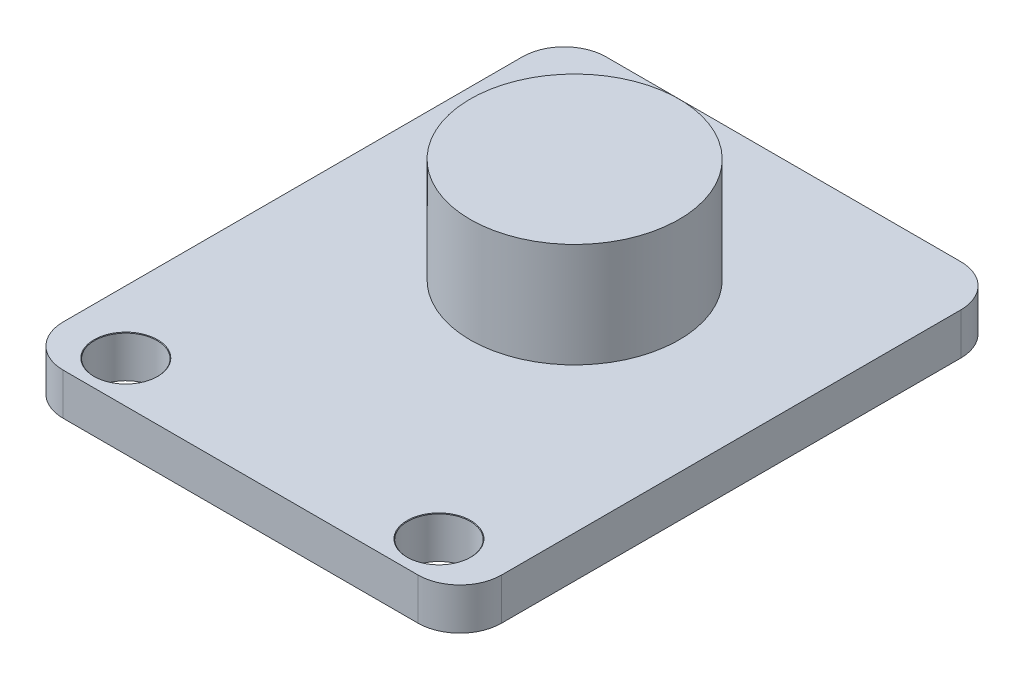
ISO-10303-21;
HEADER;
FILE_DESCRIPTION(('STEP AP214'),'2;1');
FILE_NAME('part.step','',(''),(''),'','','');
FILE_SCHEMA(('AUTOMOTIVE_DESIGN { 1 0 10303 214 1 1 1 1 }'));
ENDSEC;
DATA;
#1=APPLICATION_CONTEXT('core data for automotive mechanical design processes');
#2=APPLICATION_PROTOCOL_DEFINITION('international standard','automotive_design',2000,#1);
#3=PRODUCT_CONTEXT('',#1,'mechanical');
#4=PRODUCT('Part','Part','',(#3));
#5=PRODUCT_RELATED_PRODUCT_CATEGORY('part','',(#4));
#6=PRODUCT_DEFINITION_FORMATION('','',#4);
#7=PRODUCT_DEFINITION_CONTEXT('part definition',#1,'design');
#8=PRODUCT_DEFINITION('design','',#6,#7);
#9=PRODUCT_DEFINITION_SHAPE('','',#8);
#10=(LENGTH_UNIT() NAMED_UNIT(*) SI_UNIT(.MILLI.,.METRE.));
#11=(NAMED_UNIT(*) PLANE_ANGLE_UNIT() SI_UNIT($,.RADIAN.));
#12=(NAMED_UNIT(*) SI_UNIT($,.STERADIAN.) SOLID_ANGLE_UNIT());
#13=UNCERTAINTY_MEASURE_WITH_UNIT(LENGTH_MEASURE(1.E-05),#10,'distance_accuracy_value','');
#14=(GEOMETRIC_REPRESENTATION_CONTEXT(3) GLOBAL_UNCERTAINTY_ASSIGNED_CONTEXT((#13)) GLOBAL_UNIT_ASSIGNED_CONTEXT((#10,
#11,#12)) REPRESENTATION_CONTEXT('',''));
#15=CARTESIAN_POINT('',(0.,0.,0.));
#16=DIRECTION('',(0.,0.,1.));
#17=DIRECTION('',(1.,0.,0.));
#18=AXIS2_PLACEMENT_3D('',#15,#16,#17);
#19=CARTESIAN_POINT('',(10.5,2.,-13.));
#20=DIRECTION('',(-1.,0.,0.));
#21=DIRECTION('',(0.,0.,1.));
#22=AXIS2_PLACEMENT_3D('',#19,#20,#21);
#23=PLANE('',#22);
#24=DIRECTION('',(0.,0.,-1.));
#25=VECTOR('',#24,1.);
#26=CARTESIAN_POINT('',(10.5,0.,-13.));
#27=LINE('',#26,#25);
#28=CARTESIAN_POINT('',(10.5,0.,11.));
#29=VERTEX_POINT('',#28);
#30=CARTESIAN_POINT('',(10.5,0.,-11.));
#31=VERTEX_POINT('',#30);
#32=EDGE_CURVE('E144',#29,#31,#27,.T.);
#33=ORIENTED_EDGE('',*,*,#32,.T.);
#34=DIRECTION('',(0.,-1.,0.));
#35=VECTOR('',#34,1.);
#36=CARTESIAN_POINT('',(10.5,2.,-11.));
#37=LINE('',#36,#35);
#38=CARTESIAN_POINT('',(10.5,2.,-11.));
#39=VERTEX_POINT('',#38);
#40=EDGE_CURVE('E177',#31,#39,#37,.F.);
#41=ORIENTED_EDGE('',*,*,#40,.T.);
#42=DIRECTION('',(0.,0.,-1.));
#43=VECTOR('',#42,1.);
#44=CARTESIAN_POINT('',(10.5,2.,-13.));
#45=LINE('',#44,#43);
#46=CARTESIAN_POINT('',(10.5,2.,11.));
#47=VERTEX_POINT('',#46);
#48=EDGE_CURVE('E142',#47,#39,#45,.T.);
#49=ORIENTED_EDGE('',*,*,#48,.F.);
#50=DIRECTION('',(0.,-1.,0.));
#51=VECTOR('',#50,1.);
#52=CARTESIAN_POINT('',(10.5,2.,11.));
#53=LINE('',#52,#51);
#54=EDGE_CURVE('E173',#47,#29,#53,.T.);
#55=ORIENTED_EDGE('',*,*,#54,.T.);
#56=EDGE_LOOP('',(#33,#41,#49,#55));
#57=FACE_BOUND('',#56,.T.);
#58=ADVANCED_FACE('F39',(#57),#23,.F.);
#59=CARTESIAN_POINT('',(-10.5,2.,-13.));
#60=DIRECTION('',(0.,0.,1.));
#61=DIRECTION('',(1.,0.,0.));
#62=AXIS2_PLACEMENT_3D('',#59,#60,#61);
#63=PLANE('',#62);
#64=DIRECTION('',(-1.,0.,0.));
#65=VECTOR('',#64,1.);
#66=CARTESIAN_POINT('',(-10.5,0.,-13.));
#67=LINE('',#66,#65);
#68=CARTESIAN_POINT('',(8.5,0.,-13.));
#69=VERTEX_POINT('',#68);
#70=CARTESIAN_POINT('',(-8.5,0.,-13.));
#71=VERTEX_POINT('',#70);
#72=EDGE_CURVE('E138',#69,#71,#67,.T.);
#73=ORIENTED_EDGE('',*,*,#72,.T.);
#74=DIRECTION('',(0.,-1.,0.));
#75=VECTOR('',#74,1.);
#76=CARTESIAN_POINT('',(-8.5,2.,-13.));
#77=LINE('',#76,#75);
#78=CARTESIAN_POINT('',(-8.5,2.,-13.));
#79=VERTEX_POINT('',#78);
#80=EDGE_CURVE('E113',#71,#79,#77,.F.);
#81=ORIENTED_EDGE('',*,*,#80,.T.);
#82=DIRECTION('',(-1.,0.,0.));
#83=VECTOR('',#82,1.);
#84=CARTESIAN_POINT('',(-10.5,2.,-13.));
#85=LINE('',#84,#83);
#86=CARTESIAN_POINT('',(8.5,2.,-13.));
#87=VERTEX_POINT('',#86);
#88=EDGE_CURVE('E196',#87,#79,#85,.T.);
#89=ORIENTED_EDGE('',*,*,#88,.F.);
#90=DIRECTION('',(0.,-1.,0.));
#91=VECTOR('',#90,1.);
#92=CARTESIAN_POINT('',(8.5,2.,-13.));
#93=LINE('',#92,#91);
#94=EDGE_CURVE('E119',#87,#69,#93,.T.);
#95=ORIENTED_EDGE('',*,*,#94,.T.);
#96=EDGE_LOOP('',(#73,#81,#89,#95));
#97=FACE_BOUND('',#96,.T.);
#98=ADVANCED_FACE('F250',(#97),#63,.F.);
#99=CARTESIAN_POINT('',(-10.5,2.,-13.));
#100=DIRECTION('',(1.,0.,0.));
#101=DIRECTION('',(0.,0.,-1.));
#102=AXIS2_PLACEMENT_3D('',#99,#100,#101);
#103=PLANE('',#102);
#104=DIRECTION('',(0.,0.,1.));
#105=VECTOR('',#104,1.);
#106=CARTESIAN_POINT('',(-10.5,2.,-13.));
#107=LINE('',#106,#105);
#108=CARTESIAN_POINT('',(-10.5,2.,-11.));
#109=VERTEX_POINT('',#108);
#110=CARTESIAN_POINT('',(-10.5,2.,11.));
#111=VERTEX_POINT('',#110);
#112=EDGE_CURVE('E128',#109,#111,#107,.T.);
#113=ORIENTED_EDGE('',*,*,#112,.F.);
#114=DIRECTION('',(0.,-1.,0.));
#115=VECTOR('',#114,1.);
#116=CARTESIAN_POINT('',(-10.5,2.,-11.));
#117=LINE('',#116,#115);
#118=CARTESIAN_POINT('',(-10.5,0.,-11.));
#119=VERTEX_POINT('',#118);
#120=EDGE_CURVE('E112',#109,#119,#117,.T.);
#121=ORIENTED_EDGE('',*,*,#120,.T.);
#122=DIRECTION('',(0.,0.,1.));
#123=VECTOR('',#122,1.);
#124=CARTESIAN_POINT('',(-10.5,0.,-13.));
#125=LINE('',#124,#123);
#126=CARTESIAN_POINT('',(-10.5,0.,11.));
#127=VERTEX_POINT('',#126);
#128=EDGE_CURVE('E126',#119,#127,#125,.T.);
#129=ORIENTED_EDGE('',*,*,#128,.T.);
#130=DIRECTION('',(0.,-1.,0.));
#131=VECTOR('',#130,1.);
#132=CARTESIAN_POINT('',(-10.5,2.,11.));
#133=LINE('',#132,#131);
#134=EDGE_CURVE('E131',#127,#111,#133,.F.);
#135=ORIENTED_EDGE('',*,*,#134,.T.);
#136=EDGE_LOOP('',(#113,#121,#129,#135));
#137=FACE_BOUND('',#136,.T.);
#138=ADVANCED_FACE('F125',(#137),#103,.F.);
#139=CARTESIAN_POINT('',(-10.5,2.,13.));
#140=DIRECTION('',(0.,0.,-1.));
#141=DIRECTION('',(-1.,0.,0.));
#142=AXIS2_PLACEMENT_3D('',#139,#140,#141);
#143=PLANE('',#142);
#144=DIRECTION('',(1.,0.,0.));
#145=VECTOR('',#144,1.);
#146=CARTESIAN_POINT('',(-10.5,2.,13.));
#147=LINE('',#146,#145);
#148=CARTESIAN_POINT('',(-8.5,2.,13.));
#149=VERTEX_POINT('',#148);
#150=CARTESIAN_POINT('',(8.5,2.,13.));
#151=VERTEX_POINT('',#150);
#152=EDGE_CURVE('E149',#149,#151,#147,.T.);
#153=ORIENTED_EDGE('',*,*,#152,.F.);
#154=DIRECTION('',(0.,-1.,0.));
#155=VECTOR('',#154,1.);
#156=CARTESIAN_POINT('',(-8.49999999999999,2.,13.));
#157=LINE('',#156,#155);
#158=CARTESIAN_POINT('',(-8.5,0.,13.));
#159=VERTEX_POINT('',#158);
#160=EDGE_CURVE('E43',#149,#159,#157,.T.);
#161=ORIENTED_EDGE('',*,*,#160,.T.);
#162=DIRECTION('',(1.,0.,0.));
#163=VECTOR('',#162,1.);
#164=CARTESIAN_POINT('',(-10.5,0.,13.));
#165=LINE('',#164,#163);
#166=CARTESIAN_POINT('',(8.5,0.,13.));
#167=VERTEX_POINT('',#166);
#168=EDGE_CURVE('E137',#159,#167,#165,.T.);
#169=ORIENTED_EDGE('',*,*,#168,.T.);
#170=DIRECTION('',(0.,-1.,0.));
#171=VECTOR('',#170,1.);
#172=CARTESIAN_POINT('',(8.50000000000001,2.,13.));
#173=LINE('',#172,#171);
#174=EDGE_CURVE('E56',#167,#151,#173,.F.);
#175=ORIENTED_EDGE('',*,*,#174,.T.);
#176=EDGE_LOOP('',(#153,#161,#169,#175));
#177=FACE_BOUND('',#176,.T.);
#178=ADVANCED_FACE('F183',(#177),#143,.F.);
#179=CARTESIAN_POINT('',(0.,2.,0.));
#180=DIRECTION('',(0.,1.,0.));
#181=DIRECTION('',(0.,0.,1.));
#182=AXIS2_PLACEMENT_3D('',#179,#180,#181);
#183=PLANE('',#182);
#184=CARTESIAN_POINT('',(-7.5,2.,11.));
#185=DIRECTION('',(0.,1.,0.));
#186=DIRECTION('',(0.,0.,1.));
#187=AXIS2_PLACEMENT_3D('',#184,#185,#186);
#188=CIRCLE('',#187,1.525);
#189=CARTESIAN_POINT('',(-7.5,2.,12.525));
#190=VERTEX_POINT('',#189);
#191=EDGE_CURVE('E233',#190,#190,#188,.T.);
#192=ORIENTED_EDGE('',*,*,#191,.F.);
#193=EDGE_LOOP('',(#192));
#194=FACE_BOUND('',#193,.T.);
#195=CARTESIAN_POINT('',(7.5,2.,11.));
#196=DIRECTION('',(0.,1.,0.));
#197=DIRECTION('',(0.,0.,1.));
#198=AXIS2_PLACEMENT_3D('',#195,#196,#197);
#199=CIRCLE('',#198,1.525);
#200=CARTESIAN_POINT('',(7.5,2.,12.525));
#201=VERTEX_POINT('',#200);
#202=EDGE_CURVE('E221',#201,#201,#199,.T.);
#203=ORIENTED_EDGE('',*,*,#202,.F.);
#204=EDGE_LOOP('',(#203));
#205=FACE_BOUND('',#204,.T.);
#206=CARTESIAN_POINT('',(0.,2.,-3.));
#207=DIRECTION('',(0.,1.,0.));
#208=DIRECTION('',(0.,0.,1.));
#209=AXIS2_PLACEMENT_3D('',#206,#207,#208);
#210=CIRCLE('',#209,5.);
#211=CARTESIAN_POINT('',(0.,2.,2.));
#212=VERTEX_POINT('',#211);
#213=EDGE_CURVE('E11',#212,#212,#210,.T.);
#214=ORIENTED_EDGE('',*,*,#213,.F.);
#215=EDGE_LOOP('',(#214));
#216=FACE_BOUND('',#215,.T.);
#217=ORIENTED_EDGE('',*,*,#88,.T.);
#218=CARTESIAN_POINT('',(-8.5,2.,-11.));
#219=DIRECTION('',(0.,1.,0.));
#220=DIRECTION('',(0.,0.,1.));
#221=AXIS2_PLACEMENT_3D('',#218,#219,#220);
#222=CIRCLE('',#221,2.);
#223=EDGE_CURVE('E170',#79,#109,#222,.T.);
#224=ORIENTED_EDGE('',*,*,#223,.T.);
#225=ORIENTED_EDGE('',*,*,#112,.T.);
#226=CARTESIAN_POINT('',(-8.49999999999999,2.,11.));
#227=DIRECTION('',(0.,1.,0.));
#228=DIRECTION('',(0.,0.,1.));
#229=AXIS2_PLACEMENT_3D('',#226,#227,#228);
#230=CIRCLE('',#229,2.);
#231=EDGE_CURVE('E63',#111,#149,#230,.T.);
#232=ORIENTED_EDGE('',*,*,#231,.T.);
#233=ORIENTED_EDGE('',*,*,#152,.T.);
#234=CARTESIAN_POINT('',(8.50000000000001,2.,11.));
#235=DIRECTION('',(0.,1.,0.));
#236=DIRECTION('',(0.,0.,1.));
#237=AXIS2_PLACEMENT_3D('',#234,#235,#236);
#238=CIRCLE('',#237,2.);
#239=EDGE_CURVE('E162',#151,#47,#238,.T.);
#240=ORIENTED_EDGE('',*,*,#239,.T.);
#241=ORIENTED_EDGE('',*,*,#48,.T.);
#242=CARTESIAN_POINT('',(8.5,2.,-11.));
#243=DIRECTION('',(0.,1.,0.));
#244=DIRECTION('',(0.,0.,1.));
#245=AXIS2_PLACEMENT_3D('',#242,#243,#244);
#246=CIRCLE('',#245,2.);
#247=EDGE_CURVE('E167',#39,#87,#246,.T.);
#248=ORIENTED_EDGE('',*,*,#247,.T.);
#249=EDGE_LOOP('',(#217,#224,#225,#232,#233,#240,#241,#248));
#250=FACE_BOUND('',#249,.T.);
#251=ADVANCED_FACE('F240',(#194,#205,#216,#250),#183,.T.);
#252=CARTESIAN_POINT('',(0.,0.,0.));
#253=DIRECTION('',(0.,1.,0.));
#254=DIRECTION('',(0.,0.,1.));
#255=AXIS2_PLACEMENT_3D('',#252,#253,#254);
#256=PLANE('',#255);
#257=CARTESIAN_POINT('',(-7.5,0.,11.));
#258=DIRECTION('',(0.,1.,0.));
#259=DIRECTION('',(0.,0.,1.));
#260=AXIS2_PLACEMENT_3D('',#257,#258,#259);
#261=CIRCLE('',#260,1.5);
#262=CARTESIAN_POINT('',(-7.5,0.,12.5));
#263=VERTEX_POINT('',#262);
#264=EDGE_CURVE('E225',#263,#263,#261,.T.);
#265=ORIENTED_EDGE('',*,*,#264,.T.);
#266=EDGE_LOOP('',(#265));
#267=FACE_BOUND('',#266,.T.);
#268=CARTESIAN_POINT('',(7.5,0.,11.));
#269=DIRECTION('',(0.,1.,0.));
#270=DIRECTION('',(0.,0.,1.));
#271=AXIS2_PLACEMENT_3D('',#268,#269,#270);
#272=CIRCLE('',#271,1.5);
#273=CARTESIAN_POINT('',(7.5,0.,12.5));
#274=VERTEX_POINT('',#273);
#275=EDGE_CURVE('E210',#274,#274,#272,.T.);
#276=ORIENTED_EDGE('',*,*,#275,.T.);
#277=EDGE_LOOP('',(#276));
#278=FACE_BOUND('',#277,.T.);
#279=ORIENTED_EDGE('',*,*,#128,.F.);
#280=CARTESIAN_POINT('',(-8.5,0.,-11.));
#281=DIRECTION('',(0.,1.,0.));
#282=DIRECTION('',(0.,0.,1.));
#283=AXIS2_PLACEMENT_3D('',#280,#281,#282);
#284=CIRCLE('',#283,2.);
#285=EDGE_CURVE('E108',#119,#71,#284,.F.);
#286=ORIENTED_EDGE('',*,*,#285,.T.);
#287=ORIENTED_EDGE('',*,*,#72,.F.);
#288=CARTESIAN_POINT('',(8.5,0.,-11.));
#289=DIRECTION('',(0.,1.,0.));
#290=DIRECTION('',(0.,0.,1.));
#291=AXIS2_PLACEMENT_3D('',#288,#289,#290);
#292=CIRCLE('',#291,2.);
#293=EDGE_CURVE('E120',#69,#31,#292,.F.);
#294=ORIENTED_EDGE('',*,*,#293,.T.);
#295=ORIENTED_EDGE('',*,*,#32,.F.);
#296=CARTESIAN_POINT('',(8.50000000000001,0.,11.));
#297=DIRECTION('',(0.,1.,0.));
#298=DIRECTION('',(0.,0.,1.));
#299=AXIS2_PLACEMENT_3D('',#296,#297,#298);
#300=CIRCLE('',#299,2.);
#301=EDGE_CURVE('E130',#29,#167,#300,.F.);
#302=ORIENTED_EDGE('',*,*,#301,.T.);
#303=ORIENTED_EDGE('',*,*,#168,.F.);
#304=CARTESIAN_POINT('',(-8.49999999999999,0.,11.));
#305=DIRECTION('',(0.,1.,0.));
#306=DIRECTION('',(0.,0.,1.));
#307=AXIS2_PLACEMENT_3D('',#304,#305,#306);
#308=CIRCLE('',#307,2.);
#309=EDGE_CURVE('E135',#159,#127,#308,.F.);
#310=ORIENTED_EDGE('',*,*,#309,.T.);
#311=EDGE_LOOP('',(#279,#286,#287,#294,#295,#302,#303,#310));
#312=FACE_BOUND('',#311,.T.);
#313=ADVANCED_FACE('F133',(#267,#278,#312),#256,.F.);
#314=CARTESIAN_POINT('',(-8.5,2.,-11.));
#315=DIRECTION('',(0.,-1.,0.));
#316=DIRECTION('',(0.,0.,-1.));
#317=AXIS2_PLACEMENT_3D('',#314,#315,#316);
#318=CYLINDRICAL_SURFACE('',#317,2.);
#319=ORIENTED_EDGE('',*,*,#223,.F.);
#320=ORIENTED_EDGE('',*,*,#80,.F.);
#321=ORIENTED_EDGE('',*,*,#285,.F.);
#322=ORIENTED_EDGE('',*,*,#120,.F.);
#323=EDGE_LOOP('',(#319,#320,#321,#322));
#324=FACE_BOUND('',#323,.T.);
#325=ADVANCED_FACE('F111',(#324),#318,.T.);
#326=CARTESIAN_POINT('',(8.5,2.,-11.));
#327=DIRECTION('',(0.,-1.,0.));
#328=DIRECTION('',(0.,0.,-1.));
#329=AXIS2_PLACEMENT_3D('',#326,#327,#328);
#330=CYLINDRICAL_SURFACE('',#329,2.);
#331=ORIENTED_EDGE('',*,*,#247,.F.);
#332=ORIENTED_EDGE('',*,*,#40,.F.);
#333=ORIENTED_EDGE('',*,*,#293,.F.);
#334=ORIENTED_EDGE('',*,*,#94,.F.);
#335=EDGE_LOOP('',(#331,#332,#333,#334));
#336=FACE_BOUND('',#335,.T.);
#337=ADVANCED_FACE('F252',(#336),#330,.T.);
#338=CARTESIAN_POINT('',(-8.49999999999999,2.,11.));
#339=DIRECTION('',(0.,-1.,0.));
#340=DIRECTION('',(0.,0.,-1.));
#341=AXIS2_PLACEMENT_3D('',#338,#339,#340);
#342=CYLINDRICAL_SURFACE('',#341,2.);
#343=ORIENTED_EDGE('',*,*,#231,.F.);
#344=ORIENTED_EDGE('',*,*,#134,.F.);
#345=ORIENTED_EDGE('',*,*,#309,.F.);
#346=ORIENTED_EDGE('',*,*,#160,.F.);
#347=EDGE_LOOP('',(#343,#344,#345,#346));
#348=FACE_BOUND('',#347,.T.);
#349=ADVANCED_FACE('F254',(#348),#342,.T.);
#350=CARTESIAN_POINT('',(8.50000000000001,2.,11.));
#351=DIRECTION('',(0.,-1.,0.));
#352=DIRECTION('',(0.,0.,-1.));
#353=AXIS2_PLACEMENT_3D('',#350,#351,#352);
#354=CYLINDRICAL_SURFACE('',#353,2.);
#355=ORIENTED_EDGE('',*,*,#239,.F.);
#356=ORIENTED_EDGE('',*,*,#174,.F.);
#357=ORIENTED_EDGE('',*,*,#301,.F.);
#358=ORIENTED_EDGE('',*,*,#54,.F.);
#359=EDGE_LOOP('',(#355,#356,#357,#358));
#360=FACE_BOUND('',#359,.T.);
#361=ADVANCED_FACE('F41',(#360),#354,.T.);
#362=CARTESIAN_POINT('',(0.,7.,-3.));
#363=DIRECTION('',(0.,-1.,0.));
#364=DIRECTION('',(0.,0.,-1.));
#365=AXIS2_PLACEMENT_3D('',#362,#363,#364);
#366=CYLINDRICAL_SURFACE('',#365,5.);
#367=CARTESIAN_POINT('',(0.,7.,-3.));
#368=DIRECTION('',(0.,1.,0.));
#369=DIRECTION('',(0.,0.,1.));
#370=AXIS2_PLACEMENT_3D('',#367,#368,#369);
#371=CIRCLE('',#370,5.);
#372=CARTESIAN_POINT('',(0.,7.,2.));
#373=VERTEX_POINT('',#372);
#374=EDGE_CURVE('E207',#373,#373,#371,.T.);
#375=ORIENTED_EDGE('',*,*,#374,.F.);
#376=EDGE_LOOP('',(#375));
#377=FACE_BOUND('',#376,.T.);
#378=ORIENTED_EDGE('',*,*,#213,.T.);
#379=EDGE_LOOP('',(#378));
#380=FACE_BOUND('',#379,.T.);
#381=ADVANCED_FACE('F275',(#377,#380),#366,.T.);
#382=CARTESIAN_POINT('',(0.,7.,-3.));
#383=DIRECTION('',(0.,1.,0.));
#384=DIRECTION('',(0.,0.,1.));
#385=AXIS2_PLACEMENT_3D('',#382,#383,#384);
#386=PLANE('',#385);
#387=ORIENTED_EDGE('',*,*,#374,.T.);
#388=EDGE_LOOP('',(#387));
#389=FACE_BOUND('',#388,.T.);
#390=ADVANCED_FACE('F278',(#389),#386,.T.);
#391=CARTESIAN_POINT('',(7.5,2.,11.));
#392=DIRECTION('',(0.,1.,0.));
#393=DIRECTION('',(0.,0.,1.));
#394=AXIS2_PLACEMENT_3D('',#391,#392,#393);
#395=CYLINDRICAL_SURFACE('',#394,1.5);
#396=ORIENTED_EDGE('',*,*,#275,.F.);
#397=EDGE_LOOP('',(#396));
#398=FACE_BOUND('',#397,.T.);
#399=CARTESIAN_POINT('',(7.5,1.975,11.));
#400=DIRECTION('',(0.,1.,0.));
#401=DIRECTION('',(0.,0.,1.));
#402=AXIS2_PLACEMENT_3D('',#399,#400,#401);
#403=CIRCLE('',#402,1.5);
#404=CARTESIAN_POINT('',(7.5,1.975,12.5));
#405=VERTEX_POINT('',#404);
#406=EDGE_CURVE('E215',#405,#405,#403,.T.);
#407=ORIENTED_EDGE('',*,*,#406,.T.);
#408=EDGE_LOOP('',(#407));
#409=FACE_BOUND('',#408,.T.);
#410=ADVANCED_FACE('F282',(#398,#409),#395,.F.);
#411=CARTESIAN_POINT('',(7.5,2.,11.));
#412=DIRECTION('',(0.,1.,0.));
#413=DIRECTION('',(0.,0.,1.));
#414=AXIS2_PLACEMENT_3D('',#411,#412,#413);
#415=CONICAL_SURFACE('',#414,1.525,0.785398163397474);
#416=ORIENTED_EDGE('',*,*,#406,.F.);
#417=EDGE_LOOP('',(#416));
#418=FACE_BOUND('',#417,.T.);
#419=ORIENTED_EDGE('',*,*,#202,.T.);
#420=EDGE_LOOP('',(#419));
#421=FACE_BOUND('',#420,.T.);
#422=ADVANCED_FACE('F285',(#418,#421),#415,.F.);
#423=CARTESIAN_POINT('',(-7.5,2.,11.));
#424=DIRECTION('',(0.,1.,0.));
#425=DIRECTION('',(0.,0.,1.));
#426=AXIS2_PLACEMENT_3D('',#423,#424,#425);
#427=CYLINDRICAL_SURFACE('',#426,1.5);
#428=ORIENTED_EDGE('',*,*,#264,.F.);
#429=EDGE_LOOP('',(#428));
#430=FACE_BOUND('',#429,.T.);
#431=CARTESIAN_POINT('',(-7.5,1.975,11.));
#432=DIRECTION('',(0.,1.,0.));
#433=DIRECTION('',(0.,0.,1.));
#434=AXIS2_PLACEMENT_3D('',#431,#432,#433);
#435=CIRCLE('',#434,1.5);
#436=CARTESIAN_POINT('',(-7.5,1.975,12.5));
#437=VERTEX_POINT('',#436);
#438=EDGE_CURVE('E229',#437,#437,#435,.T.);
#439=ORIENTED_EDGE('',*,*,#438,.T.);
#440=EDGE_LOOP('',(#439));
#441=FACE_BOUND('',#440,.T.);
#442=ADVANCED_FACE('F289',(#430,#441),#427,.F.);
#443=CARTESIAN_POINT('',(-7.5,2.,11.));
#444=DIRECTION('',(0.,1.,0.));
#445=DIRECTION('',(0.,0.,1.));
#446=AXIS2_PLACEMENT_3D('',#443,#444,#445);
#447=CONICAL_SURFACE('',#446,1.525,0.785398163397474);
#448=ORIENTED_EDGE('',*,*,#438,.F.);
#449=EDGE_LOOP('',(#448));
#450=FACE_BOUND('',#449,.T.);
#451=ORIENTED_EDGE('',*,*,#191,.T.);
#452=EDGE_LOOP('',(#451));
#453=FACE_BOUND('',#452,.T.);
#454=ADVANCED_FACE('F238',(#450,#453),#447,.F.);
#455=CLOSED_SHELL('',(#58,#98,#138,#178,#251,#313,#325,#337,#349,#361,#381,#390,#410,#422,#442,#454));
#456=MANIFOLD_SOLID_BREP('B2',#455);
#457=ADVANCED_BREP_SHAPE_REPRESENTATION('',(#18,#456),#14);
#458=SHAPE_DEFINITION_REPRESENTATION(#9,#457);
ENDSEC;
END-ISO-10303-21;
